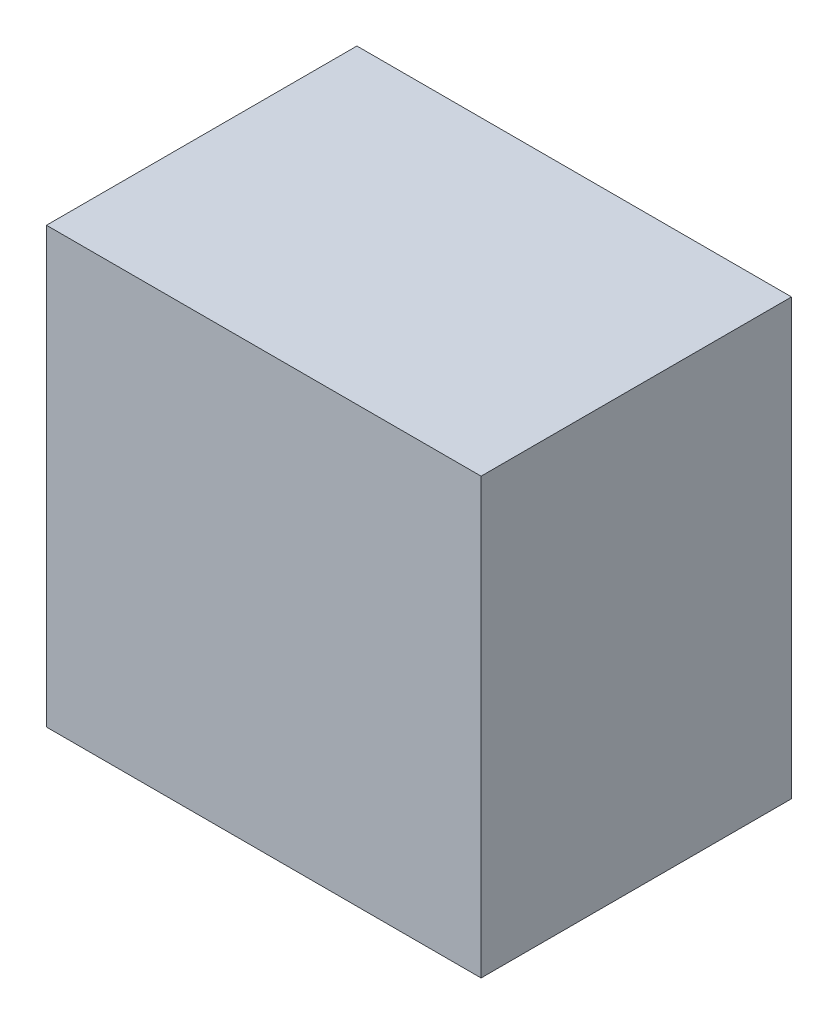
ISO-10303-21;
HEADER;
FILE_DESCRIPTION(('STEP AP214'),'2;1');
FILE_NAME('part.step','',(''),(''),'','','');
FILE_SCHEMA(('AUTOMOTIVE_DESIGN { 1 0 10303 214 1 1 1 1 }'));
ENDSEC;
DATA;
#1=APPLICATION_CONTEXT('core data for automotive mechanical design processes');
#2=APPLICATION_PROTOCOL_DEFINITION('international standard','automotive_design',2000,#1);
#3=PRODUCT_CONTEXT('',#1,'mechanical');
#4=PRODUCT('Part','Part','',(#3));
#5=PRODUCT_RELATED_PRODUCT_CATEGORY('part','',(#4));
#6=PRODUCT_DEFINITION_FORMATION('','',#4);
#7=PRODUCT_DEFINITION_CONTEXT('part definition',#1,'design');
#8=PRODUCT_DEFINITION('design','',#6,#7);
#9=PRODUCT_DEFINITION_SHAPE('','',#8);
#10=(LENGTH_UNIT() NAMED_UNIT(*) SI_UNIT(.MILLI.,.METRE.));
#11=(NAMED_UNIT(*) PLANE_ANGLE_UNIT() SI_UNIT($,.RADIAN.));
#12=(NAMED_UNIT(*) SI_UNIT($,.STERADIAN.) SOLID_ANGLE_UNIT());
#13=UNCERTAINTY_MEASURE_WITH_UNIT(LENGTH_MEASURE(1.E-05),#10,'distance_accuracy_value','');
#14=(GEOMETRIC_REPRESENTATION_CONTEXT(3) GLOBAL_UNCERTAINTY_ASSIGNED_CONTEXT((#13)) GLOBAL_UNIT_ASSIGNED_CONTEXT((#10,
#11,#12)) REPRESENTATION_CONTEXT('',''));
#15=CARTESIAN_POINT('',(0.,0.,0.));
#16=DIRECTION('',(0.,0.,1.));
#17=DIRECTION('',(1.,0.,0.));
#18=AXIS2_PLACEMENT_3D('',#15,#16,#17);
#19=CARTESIAN_POINT('',(-28.,40.,-780.));
#20=DIRECTION('',(-1.,0.,0.));
#21=DIRECTION('',(0.,0.,1.));
#22=AXIS2_PLACEMENT_3D('',#19,#20,#21);
#23=PLANE('',#22);
#24=DIRECTION('',(0.,-1.,0.));
#25=VECTOR('',#24,1.);
#26=CARTESIAN_POINT('',(-28.,40.,-740.));
#27=LINE('',#26,#25);
#28=CARTESIAN_POINT('',(-28.,96.,-740.));
#29=VERTEX_POINT('',#28);
#30=CARTESIAN_POINT('',(-28.,40.,-740.));
#31=VERTEX_POINT('',#30);
#32=EDGE_CURVE('E103',#29,#31,#27,.T.);
#33=ORIENTED_EDGE('',*,*,#32,.F.);
#34=DIRECTION('',(0.,0.,1.));
#35=VECTOR('',#34,1.);
#36=CARTESIAN_POINT('',(-28.,96.,-780.));
#37=LINE('',#36,#35);
#38=CARTESIAN_POINT('',(-28.,96.,-780.));
#39=VERTEX_POINT('',#38);
#40=EDGE_CURVE('E11',#39,#29,#37,.T.);
#41=ORIENTED_EDGE('',*,*,#40,.F.);
#42=DIRECTION('',(0.,-1.,0.));
#43=VECTOR('',#42,1.);
#44=CARTESIAN_POINT('',(-28.,40.,-780.));
#45=LINE('',#44,#43);
#46=CARTESIAN_POINT('',(-28.,40.,-780.));
#47=VERTEX_POINT('',#46);
#48=EDGE_CURVE('E97',#39,#47,#45,.T.);
#49=ORIENTED_EDGE('',*,*,#48,.T.);
#50=DIRECTION('',(0.,0.,1.));
#51=VECTOR('',#50,1.);
#52=CARTESIAN_POINT('',(-28.,40.,-780.));
#53=LINE('',#52,#51);
#54=EDGE_CURVE('E42',#47,#31,#53,.T.);
#55=ORIENTED_EDGE('',*,*,#54,.T.);
#56=EDGE_LOOP('',(#33,#41,#49,#55));
#57=FACE_BOUND('',#56,.T.);
#58=ADVANCED_FACE('F39',(#57),#23,.T.);
#59=CARTESIAN_POINT('',(-28.,96.,-780.));
#60=DIRECTION('',(0.,1.,0.));
#61=DIRECTION('',(0.,0.,1.));
#62=AXIS2_PLACEMENT_3D('',#59,#60,#61);
#63=PLANE('',#62);
#64=DIRECTION('',(-1.,0.,0.));
#65=VECTOR('',#64,1.);
#66=CARTESIAN_POINT('',(-28.,96.,-740.));
#67=LINE('',#66,#65);
#68=CARTESIAN_POINT('',(28.,96.,-740.));
#69=VERTEX_POINT('',#68);
#70=EDGE_CURVE('E99',#69,#29,#67,.T.);
#71=ORIENTED_EDGE('',*,*,#70,.F.);
#72=DIRECTION('',(0.,0.,1.));
#73=VECTOR('',#72,1.);
#74=CARTESIAN_POINT('',(28.,96.,-780.));
#75=LINE('',#74,#73);
#76=CARTESIAN_POINT('',(28.,96.,-780.));
#77=VERTEX_POINT('',#76);
#78=EDGE_CURVE('E48',#77,#69,#75,.T.);
#79=ORIENTED_EDGE('',*,*,#78,.F.);
#80=DIRECTION('',(-1.,0.,0.));
#81=VECTOR('',#80,1.);
#82=CARTESIAN_POINT('',(-28.,96.,-780.));
#83=LINE('',#82,#81);
#84=EDGE_CURVE('E94',#77,#39,#83,.T.);
#85=ORIENTED_EDGE('',*,*,#84,.T.);
#86=ORIENTED_EDGE('',*,*,#40,.T.);
#87=EDGE_LOOP('',(#71,#79,#85,#86));
#88=FACE_BOUND('',#87,.T.);
#89=ADVANCED_FACE('F113',(#88),#63,.T.);
#90=CARTESIAN_POINT('',(28.,40.,-780.));
#91=DIRECTION('',(1.,0.,0.));
#92=DIRECTION('',(0.,0.,-1.));
#93=AXIS2_PLACEMENT_3D('',#90,#91,#92);
#94=PLANE('',#93);
#95=DIRECTION('',(0.,1.,0.));
#96=VECTOR('',#95,1.);
#97=CARTESIAN_POINT('',(28.,40.,-740.));
#98=LINE('',#97,#96);
#99=CARTESIAN_POINT('',(28.,40.,-740.));
#100=VERTEX_POINT('',#99);
#101=EDGE_CURVE('E89',#100,#69,#98,.T.);
#102=ORIENTED_EDGE('',*,*,#101,.F.);
#103=DIRECTION('',(0.,0.,1.));
#104=VECTOR('',#103,1.);
#105=CARTESIAN_POINT('',(28.,40.,-780.));
#106=LINE('',#105,#104);
#107=CARTESIAN_POINT('',(28.,40.,-780.));
#108=VERTEX_POINT('',#107);
#109=EDGE_CURVE('E84',#108,#100,#106,.T.);
#110=ORIENTED_EDGE('',*,*,#109,.F.);
#111=DIRECTION('',(0.,1.,0.));
#112=VECTOR('',#111,1.);
#113=CARTESIAN_POINT('',(28.,40.,-780.));
#114=LINE('',#113,#112);
#115=EDGE_CURVE('E87',#108,#77,#114,.T.);
#116=ORIENTED_EDGE('',*,*,#115,.T.);
#117=ORIENTED_EDGE('',*,*,#78,.T.);
#118=EDGE_LOOP('',(#102,#110,#116,#117));
#119=FACE_BOUND('',#118,.T.);
#120=ADVANCED_FACE('F86',(#119),#94,.T.);
#121=CARTESIAN_POINT('',(-28.,40.,-780.));
#122=DIRECTION('',(0.,-1.,0.));
#123=DIRECTION('',(0.,0.,-1.));
#124=AXIS2_PLACEMENT_3D('',#121,#122,#123);
#125=PLANE('',#124);
#126=DIRECTION('',(1.,0.,0.));
#127=VECTOR('',#126,1.);
#128=CARTESIAN_POINT('',(-28.,40.,-740.));
#129=LINE('',#128,#127);
#130=EDGE_CURVE('E106',#31,#100,#129,.T.);
#131=ORIENTED_EDGE('',*,*,#130,.F.);
#132=ORIENTED_EDGE('',*,*,#54,.F.);
#133=DIRECTION('',(1.,0.,0.));
#134=VECTOR('',#133,1.);
#135=CARTESIAN_POINT('',(-28.,40.,-780.));
#136=LINE('',#135,#134);
#137=EDGE_CURVE('E93',#47,#108,#136,.T.);
#138=ORIENTED_EDGE('',*,*,#137,.T.);
#139=ORIENTED_EDGE('',*,*,#109,.T.);
#140=EDGE_LOOP('',(#131,#132,#138,#139));
#141=FACE_BOUND('',#140,.T.);
#142=ADVANCED_FACE('F96',(#141),#125,.T.);
#143=CARTESIAN_POINT('',(0.,0.,-780.));
#144=DIRECTION('',(0.,0.,-1.));
#145=DIRECTION('',(-1.,0.,0.));
#146=AXIS2_PLACEMENT_3D('',#143,#144,#145);
#147=PLANE('',#146);
#148=ORIENTED_EDGE('',*,*,#48,.F.);
#149=ORIENTED_EDGE('',*,*,#84,.F.);
#150=ORIENTED_EDGE('',*,*,#115,.F.);
#151=ORIENTED_EDGE('',*,*,#137,.F.);
#152=EDGE_LOOP('',(#148,#149,#150,#151));
#153=FACE_BOUND('',#152,.T.);
#154=ADVANCED_FACE('F92',(#153),#147,.T.);
#155=CARTESIAN_POINT('',(0.,0.,-740.));
#156=DIRECTION('',(0.,0.,-1.));
#157=DIRECTION('',(-1.,0.,0.));
#158=AXIS2_PLACEMENT_3D('',#155,#156,#157);
#159=PLANE('',#158);
#160=ORIENTED_EDGE('',*,*,#32,.T.);
#161=ORIENTED_EDGE('',*,*,#130,.T.);
#162=ORIENTED_EDGE('',*,*,#101,.T.);
#163=ORIENTED_EDGE('',*,*,#70,.T.);
#164=EDGE_LOOP('',(#160,#161,#162,#163));
#165=FACE_BOUND('',#164,.T.);
#166=ADVANCED_FACE('F112',(#165),#159,.F.);
#167=CLOSED_SHELL('',(#58,#89,#120,#142,#154,#166));
#168=MANIFOLD_SOLID_BREP('B2',#167);
#169=ADVANCED_BREP_SHAPE_REPRESENTATION('',(#18,#168),#14);
#170=SHAPE_DEFINITION_REPRESENTATION(#9,#169);
ENDSEC;
END-ISO-10303-21;
